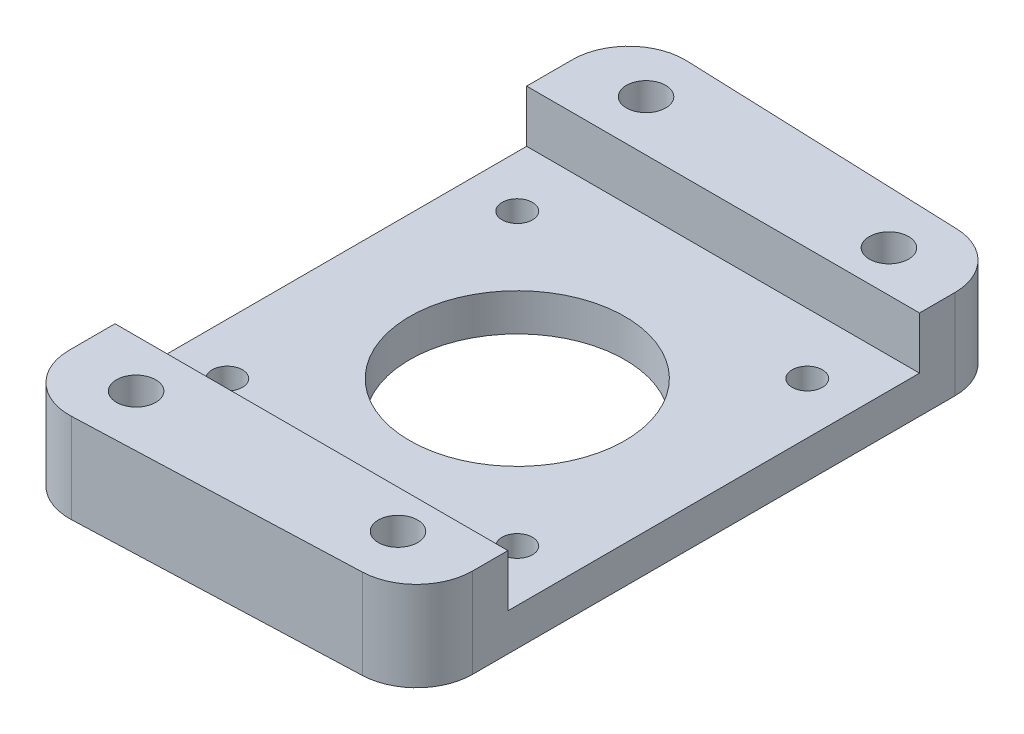
ISO-10303-21;
HEADER;
FILE_DESCRIPTION(('STEP AP214'),'2;1');
FILE_NAME('part.step','',(''),(''),'','','');
FILE_SCHEMA(('AUTOMOTIVE_DESIGN { 1 0 10303 214 1 1 1 1 }'));
ENDSEC;
DATA;
#1=APPLICATION_CONTEXT('core data for automotive mechanical design processes');
#2=APPLICATION_PROTOCOL_DEFINITION('international standard','automotive_design',2000,#1);
#3=PRODUCT_CONTEXT('',#1,'mechanical');
#4=PRODUCT('Part','Part','',(#3));
#5=PRODUCT_RELATED_PRODUCT_CATEGORY('part','',(#4));
#6=PRODUCT_DEFINITION_FORMATION('','',#4);
#7=PRODUCT_DEFINITION_CONTEXT('part definition',#1,'design');
#8=PRODUCT_DEFINITION('design','',#6,#7);
#9=PRODUCT_DEFINITION_SHAPE('','',#8);
#10=(LENGTH_UNIT() NAMED_UNIT(*) SI_UNIT(.MILLI.,.METRE.));
#11=(NAMED_UNIT(*) PLANE_ANGLE_UNIT() SI_UNIT($,.RADIAN.));
#12=(NAMED_UNIT(*) SI_UNIT($,.STERADIAN.) SOLID_ANGLE_UNIT());
#13=UNCERTAINTY_MEASURE_WITH_UNIT(LENGTH_MEASURE(1.E-05),#10,'distance_accuracy_value','');
#14=(GEOMETRIC_REPRESENTATION_CONTEXT(3) GLOBAL_UNCERTAINTY_ASSIGNED_CONTEXT((#13)) GLOBAL_UNIT_ASSIGNED_CONTEXT((#10,
#11,#12)) REPRESENTATION_CONTEXT('',''));
#15=CARTESIAN_POINT('',(0.,0.,0.));
#16=DIRECTION('',(0.,0.,1.));
#17=DIRECTION('',(1.,0.,0.));
#18=AXIS2_PLACEMENT_3D('',#15,#16,#17);
#19=CARTESIAN_POINT('',(0.,4.,0.));
#20=DIRECTION('',(0.,-1.,0.));
#21=DIRECTION('',(0.,0.,-1.));
#22=AXIS2_PLACEMENT_3D('',#19,#20,#21);
#23=PLANE('',#22);
#24=CARTESIAN_POINT('',(0.,4.,0.));
#25=DIRECTION('',(0.,1.,0.));
#26=DIRECTION('',(0.,0.,1.));
#27=AXIS2_PLACEMENT_3D('',#24,#25,#26);
#28=CIRCLE('',#27,11.5);
#29=CARTESIAN_POINT('',(0.,4.,11.5));
#30=VERTEX_POINT('',#29);
#31=EDGE_CURVE('E225',#30,#30,#28,.T.);
#32=ORIENTED_EDGE('',*,*,#31,.F.);
#33=EDGE_LOOP('',(#32));
#34=FACE_BOUND('',#33,.T.);
#35=CARTESIAN_POINT('',(-15.5,4.,-15.5));
#36=DIRECTION('',(0.,1.,0.));
#37=DIRECTION('',(0.,0.,1.));
#38=AXIS2_PLACEMENT_3D('',#35,#36,#37);
#39=CIRCLE('',#38,1.625);
#40=CARTESIAN_POINT('',(-15.5,4.,-13.875));
#41=VERTEX_POINT('',#40);
#42=EDGE_CURVE('E201',#41,#41,#39,.T.);
#43=ORIENTED_EDGE('',*,*,#42,.F.);
#44=EDGE_LOOP('',(#43));
#45=FACE_BOUND('',#44,.T.);
#46=CARTESIAN_POINT('',(15.5,4.,-15.5));
#47=DIRECTION('',(0.,1.,0.));
#48=DIRECTION('',(0.,0.,1.));
#49=AXIS2_PLACEMENT_3D('',#46,#47,#48);
#50=CIRCLE('',#49,1.625);
#51=CARTESIAN_POINT('',(15.5,4.,-13.875));
#52=VERTEX_POINT('',#51);
#53=EDGE_CURVE('E202',#52,#52,#50,.T.);
#54=ORIENTED_EDGE('',*,*,#53,.F.);
#55=EDGE_LOOP('',(#54));
#56=FACE_BOUND('',#55,.T.);
#57=CARTESIAN_POINT('',(15.5,4.,15.5));
#58=DIRECTION('',(0.,1.,0.));
#59=DIRECTION('',(0.,0.,1.));
#60=AXIS2_PLACEMENT_3D('',#57,#58,#59);
#61=CIRCLE('',#60,1.625);
#62=CARTESIAN_POINT('',(15.5,4.,17.125));
#63=VERTEX_POINT('',#62);
#64=EDGE_CURVE('E210',#63,#63,#61,.T.);
#65=ORIENTED_EDGE('',*,*,#64,.F.);
#66=EDGE_LOOP('',(#65));
#67=FACE_BOUND('',#66,.T.);
#68=CARTESIAN_POINT('',(-15.5,4.,15.5));
#69=DIRECTION('',(0.,1.,0.));
#70=DIRECTION('',(0.,0.,1.));
#71=AXIS2_PLACEMENT_3D('',#68,#69,#70);
#72=CIRCLE('',#71,1.625);
#73=CARTESIAN_POINT('',(-15.5,4.,17.125));
#74=VERTEX_POINT('',#73);
#75=EDGE_CURVE('E193',#74,#74,#72,.T.);
#76=ORIENTED_EDGE('',*,*,#75,.F.);
#77=EDGE_LOOP('',(#76));
#78=FACE_BOUND('',#77,.T.);
#79=DIRECTION('',(1.,0.,0.));
#80=VECTOR('',#79,1.);
#81=CARTESIAN_POINT('',(21.,4.,-22.));
#82=LINE('',#81,#80);
#83=CARTESIAN_POINT('',(-21.,4.,-22.));
#84=VERTEX_POINT('',#83);
#85=CARTESIAN_POINT('',(21.,4.,-22.));
#86=VERTEX_POINT('',#85);
#87=EDGE_CURVE('E147',#84,#86,#82,.T.);
#88=ORIENTED_EDGE('',*,*,#87,.F.);
#89=DIRECTION('',(0.,0.,1.));
#90=VECTOR('',#89,1.);
#91=CARTESIAN_POINT('',(-21.,4.,33.1322853994245));
#92=LINE('',#91,#90);
#93=CARTESIAN_POINT('',(-21.,4.,22.));
#94=VERTEX_POINT('',#93);
#95=EDGE_CURVE('E237',#84,#94,#92,.T.);
#96=ORIENTED_EDGE('',*,*,#95,.T.);
#97=DIRECTION('',(1.,0.,0.));
#98=VECTOR('',#97,1.);
#99=CARTESIAN_POINT('',(21.,4.,22.));
#100=LINE('',#99,#98);
#101=CARTESIAN_POINT('',(21.,4.,22.));
#102=VERTEX_POINT('',#101);
#103=EDGE_CURVE('E170',#94,#102,#100,.T.);
#104=ORIENTED_EDGE('',*,*,#103,.T.);
#105=DIRECTION('',(0.,0.,-1.));
#106=VECTOR('',#105,1.);
#107=CARTESIAN_POINT('',(21.,4.,31.5520850869607));
#108=LINE('',#107,#106);
#109=EDGE_CURVE('E240',#102,#86,#108,.T.);
#110=ORIENTED_EDGE('',*,*,#109,.T.);
#111=EDGE_LOOP('',(#88,#96,#104,#110));
#112=FACE_BOUND('',#111,.T.);
#113=ADVANCED_FACE('F39',(#34,#45,#56,#67,#78,#112),#23,.F.);
#114=CARTESIAN_POINT('',(-21.,4.,33.1322853994245));
#115=DIRECTION('',(1.,0.,0.));
#116=DIRECTION('',(0.,0.,-1.));
#117=AXIS2_PLACEMENT_3D('',#114,#115,#116);
#118=PLANE('',#117);
#119=DIRECTION('',(0.,0.,1.));
#120=VECTOR('',#119,1.);
#121=CARTESIAN_POINT('',(-21.,9.575,-22.));
#122=LINE('',#121,#120);
#123=CARTESIAN_POINT('',(-21.,9.575,-26.9022973446123));
#124=VERTEX_POINT('',#123);
#125=CARTESIAN_POINT('',(-21.,9.575,-22.));
#126=VERTEX_POINT('',#125);
#127=EDGE_CURVE('E137',#124,#126,#122,.T.);
#128=ORIENTED_EDGE('',*,*,#127,.F.);
#129=DIRECTION('',(0.,-1.,0.));
#130=VECTOR('',#129,1.);
#131=CARTESIAN_POINT('',(-21.,4.,-26.9022973446123));
#132=LINE('',#131,#130);
#133=CARTESIAN_POINT('',(-21.,0.,-26.9022973446123));
#134=VERTEX_POINT('',#133);
#135=EDGE_CURVE('E259',#124,#134,#132,.T.);
#136=ORIENTED_EDGE('',*,*,#135,.T.);
#137=DIRECTION('',(0.,0.,1.));
#138=VECTOR('',#137,1.);
#139=CARTESIAN_POINT('',(-21.,0.,33.1322853994245));
#140=LINE('',#139,#138);
#141=CARTESIAN_POINT('',(-21.,0.,26.9022973446123));
#142=VERTEX_POINT('',#141);
#143=EDGE_CURVE('E233',#134,#142,#140,.T.);
#144=ORIENTED_EDGE('',*,*,#143,.T.);
#145=DIRECTION('',(0.,-1.,0.));
#146=VECTOR('',#145,1.);
#147=CARTESIAN_POINT('',(-21.,4.,26.9022973446123));
#148=LINE('',#147,#146);
#149=CARTESIAN_POINT('',(-21.,9.575,26.9022973446123));
#150=VERTEX_POINT('',#149);
#151=EDGE_CURVE('E244',#142,#150,#148,.F.);
#152=ORIENTED_EDGE('',*,*,#151,.T.);
#153=DIRECTION('',(0.,0.,-1.));
#154=VECTOR('',#153,1.);
#155=CARTESIAN_POINT('',(-21.,9.575,22.));
#156=LINE('',#155,#154);
#157=CARTESIAN_POINT('',(-21.,9.575,22.));
#158=VERTEX_POINT('',#157);
#159=EDGE_CURVE('E175',#150,#158,#156,.T.);
#160=ORIENTED_EDGE('',*,*,#159,.T.);
#161=DIRECTION('',(0.,-1.,0.));
#162=VECTOR('',#161,1.);
#163=CARTESIAN_POINT('',(-21.,9.575,22.));
#164=LINE('',#163,#162);
#165=EDGE_CURVE('E186',#158,#94,#164,.T.);
#166=ORIENTED_EDGE('',*,*,#165,.T.);
#167=ORIENTED_EDGE('',*,*,#95,.F.);
#168=DIRECTION('',(0.,-1.,0.));
#169=VECTOR('',#168,1.);
#170=CARTESIAN_POINT('',(-21.,9.575,-22.));
#171=LINE('',#170,#169);
#172=EDGE_CURVE('E151',#126,#84,#171,.T.);
#173=ORIENTED_EDGE('',*,*,#172,.F.);
#174=EDGE_LOOP('',(#128,#136,#144,#152,#160,#166,#167,#173));
#175=FACE_BOUND('',#174,.T.);
#176=ADVANCED_FACE('F321',(#175),#118,.F.);
#177=CARTESIAN_POINT('',(-21.,4.,33.1322853994245));
#178=DIRECTION('',(-0.0375972159741946,0.,-0.999292974733131));
#179=DIRECTION('',(-0.999292974733131,0.,0.0375972159741946));
#180=AXIS2_PLACEMENT_3D('',#177,#178,#179);
#181=PLANE('',#180);
#182=DIRECTION('',(0.999292974733131,0.,-0.0375972159741946));
#183=VECTOR('',#182,1.);
#184=CARTESIAN_POINT('',(-21.,0.,33.1322853994245));
#185=LINE('',#184,#183);
#186=CARTESIAN_POINT('',(-14.7744167041548,0.,32.8980551930111));
#187=VERTEX_POINT('',#186);
#188=CARTESIAN_POINT('',(15.2255832958452,0.,31.7693406841084));
#189=VERTEX_POINT('',#188);
#190=EDGE_CURVE('E248',#187,#189,#185,.T.);
#191=ORIENTED_EDGE('',*,*,#190,.T.);
#192=DIRECTION('',(0.,-1.,0.));
#193=VECTOR('',#192,1.);
#194=CARTESIAN_POINT('',(15.2255832958452,4.,31.7693406841084));
#195=LINE('',#194,#193);
#196=CARTESIAN_POINT('',(15.2255832958452,9.575,31.7693406841084));
#197=VERTEX_POINT('',#196);
#198=EDGE_CURVE('E61',#189,#197,#195,.F.);
#199=ORIENTED_EDGE('',*,*,#198,.T.);
#200=DIRECTION('',(-0.999292974733131,0.,0.0375972159741946));
#201=VECTOR('',#200,1.);
#202=CARTESIAN_POINT('',(-21.,9.575,33.1322853994245));
#203=LINE('',#202,#201);
#204=CARTESIAN_POINT('',(-14.7744167041548,9.575,32.8980551930111));
#205=VERTEX_POINT('',#204);
#206=EDGE_CURVE('E172',#197,#205,#203,.T.);
#207=ORIENTED_EDGE('',*,*,#206,.T.);
#208=DIRECTION('',(0.,-1.,0.));
#209=VECTOR('',#208,1.);
#210=CARTESIAN_POINT('',(-14.7744167041548,4.,32.8980551930111));
#211=LINE('',#210,#209);
#212=EDGE_CURVE('E294',#205,#187,#211,.T.);
#213=ORIENTED_EDGE('',*,*,#212,.T.);
#214=EDGE_LOOP('',(#191,#199,#207,#213));
#215=FACE_BOUND('',#214,.T.);
#216=ADVANCED_FACE('F302',(#215),#181,.F.);
#217=CARTESIAN_POINT('',(21.,4.,31.5520850869607));
#218=DIRECTION('',(-1.,0.,0.));
#219=DIRECTION('',(0.,0.,1.));
#220=AXIS2_PLACEMENT_3D('',#217,#218,#219);
#221=PLANE('',#220);
#222=DIRECTION('',(0.,0.,-1.));
#223=VECTOR('',#222,1.);
#224=CARTESIAN_POINT('',(21.,0.,31.5520850869607));
#225=LINE('',#224,#223);
#226=CARTESIAN_POINT('',(21.,0.,25.7735828357096));
#227=VERTEX_POINT('',#226);
#228=CARTESIAN_POINT('',(21.,0.,-25.7735828357096));
#229=VERTEX_POINT('',#228);
#230=EDGE_CURVE('E251',#227,#229,#225,.T.);
#231=ORIENTED_EDGE('',*,*,#230,.T.);
#232=DIRECTION('',(0.,-1.,0.));
#233=VECTOR('',#232,1.);
#234=CARTESIAN_POINT('',(21.,4.,-25.7735828357096));
#235=LINE('',#234,#233);
#236=CARTESIAN_POINT('',(21.,9.575,-25.7735828357096));
#237=VERTEX_POINT('',#236);
#238=EDGE_CURVE('E156',#229,#237,#235,.F.);
#239=ORIENTED_EDGE('',*,*,#238,.T.);
#240=DIRECTION('',(0.,0.,-1.));
#241=VECTOR('',#240,1.);
#242=CARTESIAN_POINT('',(21.,9.575,-31.5520850869607));
#243=LINE('',#242,#241);
#244=CARTESIAN_POINT('',(21.,9.575,-22.));
#245=VERTEX_POINT('',#244);
#246=EDGE_CURVE('E134',#245,#237,#243,.T.);
#247=ORIENTED_EDGE('',*,*,#246,.F.);
#248=DIRECTION('',(0.,-1.,0.));
#249=VECTOR('',#248,1.);
#250=CARTESIAN_POINT('',(21.,9.575,-22.));
#251=LINE('',#250,#249);
#252=EDGE_CURVE('E145',#245,#86,#251,.T.);
#253=ORIENTED_EDGE('',*,*,#252,.T.);
#254=ORIENTED_EDGE('',*,*,#109,.F.);
#255=DIRECTION('',(0.,-1.,0.));
#256=VECTOR('',#255,1.);
#257=CARTESIAN_POINT('',(21.,9.575,22.));
#258=LINE('',#257,#256);
#259=CARTESIAN_POINT('',(21.,9.575,22.));
#260=VERTEX_POINT('',#259);
#261=EDGE_CURVE('E190',#260,#102,#258,.T.);
#262=ORIENTED_EDGE('',*,*,#261,.F.);
#263=DIRECTION('',(0.,0.,1.));
#264=VECTOR('',#263,1.);
#265=CARTESIAN_POINT('',(21.,9.575,31.5520850869607));
#266=LINE('',#265,#264);
#267=CARTESIAN_POINT('',(21.,9.575,25.7735828357096));
#268=VERTEX_POINT('',#267);
#269=EDGE_CURVE('E182',#260,#268,#266,.T.);
#270=ORIENTED_EDGE('',*,*,#269,.T.);
#271=DIRECTION('',(0.,-1.,0.));
#272=VECTOR('',#271,1.);
#273=CARTESIAN_POINT('',(21.,4.,25.7735828357096));
#274=LINE('',#273,#272);
#275=EDGE_CURVE('E288',#268,#227,#274,.T.);
#276=ORIENTED_EDGE('',*,*,#275,.T.);
#277=EDGE_LOOP('',(#231,#239,#247,#253,#254,#262,#270,#276));
#278=FACE_BOUND('',#277,.T.);
#279=ADVANCED_FACE('F154',(#278),#221,.F.);
#280=CARTESIAN_POINT('',(-21.,4.,-33.1322853994245));
#281=DIRECTION('',(-0.0375972159741946,0.,0.999292974733131));
#282=DIRECTION('',(0.999292974733131,0.,0.0375972159741946));
#283=AXIS2_PLACEMENT_3D('',#280,#281,#282);
#284=PLANE('',#283);
#285=DIRECTION('',(-0.999292974733131,0.,-0.0375972159741946));
#286=VECTOR('',#285,1.);
#287=CARTESIAN_POINT('',(-21.,0.,-33.1322853994245));
#288=LINE('',#287,#286);
#289=CARTESIAN_POINT('',(15.2255832958452,0.,-31.7693406841084));
#290=VERTEX_POINT('',#289);
#291=CARTESIAN_POINT('',(-14.7744167041548,0.,-32.8980551930111));
#292=VERTEX_POINT('',#291);
#293=EDGE_CURVE('E241',#290,#292,#288,.T.);
#294=ORIENTED_EDGE('',*,*,#293,.T.);
#295=DIRECTION('',(0.,-1.,0.));
#296=VECTOR('',#295,1.);
#297=CARTESIAN_POINT('',(-14.7744167041548,4.,-32.8980551930111));
#298=LINE('',#297,#296);
#299=CARTESIAN_POINT('',(-14.7744167041548,9.575,-32.8980551930111));
#300=VERTEX_POINT('',#299);
#301=EDGE_CURVE('E279',#292,#300,#298,.F.);
#302=ORIENTED_EDGE('',*,*,#301,.T.);
#303=DIRECTION('',(-0.999292974733131,0.,-0.0375972159741946));
#304=VECTOR('',#303,1.);
#305=CARTESIAN_POINT('',(-21.,9.575,-33.1322853994245));
#306=LINE('',#305,#304);
#307=CARTESIAN_POINT('',(15.2255832958452,9.575,-31.7693406841084));
#308=VERTEX_POINT('',#307);
#309=EDGE_CURVE('E158',#308,#300,#306,.T.);
#310=ORIENTED_EDGE('',*,*,#309,.F.);
#311=DIRECTION('',(0.,-1.,0.));
#312=VECTOR('',#311,1.);
#313=CARTESIAN_POINT('',(15.2255832958452,4.,-31.7693406841084));
#314=LINE('',#313,#312);
#315=EDGE_CURVE('E275',#308,#290,#314,.T.);
#316=ORIENTED_EDGE('',*,*,#315,.T.);
#317=EDGE_LOOP('',(#294,#302,#310,#316));
#318=FACE_BOUND('',#317,.T.);
#319=ADVANCED_FACE('F343',(#318),#284,.F.);
#320=CARTESIAN_POINT('',(0.,0.,0.));
#321=DIRECTION('',(0.,-1.,0.));
#322=DIRECTION('',(0.,0.,-1.));
#323=AXIS2_PLACEMENT_3D('',#320,#321,#322);
#324=PLANE('',#323);
#325=CARTESIAN_POINT('',(-15.5,0.,15.5));
#326=DIRECTION('',(0.,1.,0.));
#327=DIRECTION('',(0.,0.,1.));
#328=AXIS2_PLACEMENT_3D('',#325,#326,#327);
#329=CIRCLE('',#328,1.625);
#330=CARTESIAN_POINT('',(-15.5,0.,17.125));
#331=VERTEX_POINT('',#330);
#332=EDGE_CURVE('E214',#331,#331,#329,.T.);
#333=ORIENTED_EDGE('',*,*,#332,.T.);
#334=EDGE_LOOP('',(#333));
#335=FACE_BOUND('',#334,.T.);
#336=CARTESIAN_POINT('',(15.5,0.,15.5));
#337=DIRECTION('',(0.,1.,0.));
#338=DIRECTION('',(0.,0.,1.));
#339=AXIS2_PLACEMENT_3D('',#336,#337,#338);
#340=CIRCLE('',#339,1.625);
#341=CARTESIAN_POINT('',(15.5,0.,17.125));
#342=VERTEX_POINT('',#341);
#343=EDGE_CURVE('E206',#342,#342,#340,.T.);
#344=ORIENTED_EDGE('',*,*,#343,.T.);
#345=EDGE_LOOP('',(#344));
#346=FACE_BOUND('',#345,.T.);
#347=CARTESIAN_POINT('',(15.5,0.,-15.5));
#348=DIRECTION('',(0.,1.,0.));
#349=DIRECTION('',(0.,0.,1.));
#350=AXIS2_PLACEMENT_3D('',#347,#348,#349);
#351=CIRCLE('',#350,1.625);
#352=CARTESIAN_POINT('',(15.5,0.,-13.875));
#353=VERTEX_POINT('',#352);
#354=EDGE_CURVE('E197',#353,#353,#351,.T.);
#355=ORIENTED_EDGE('',*,*,#354,.T.);
#356=EDGE_LOOP('',(#355));
#357=FACE_BOUND('',#356,.T.);
#358=CARTESIAN_POINT('',(-15.5,0.,-15.5));
#359=DIRECTION('',(0.,1.,0.));
#360=DIRECTION('',(0.,0.,1.));
#361=AXIS2_PLACEMENT_3D('',#358,#359,#360);
#362=CIRCLE('',#361,1.625);
#363=CARTESIAN_POINT('',(-15.5,0.,-13.875));
#364=VERTEX_POINT('',#363);
#365=EDGE_CURVE('E221',#364,#364,#362,.T.);
#366=ORIENTED_EDGE('',*,*,#365,.T.);
#367=EDGE_LOOP('',(#366));
#368=FACE_BOUND('',#367,.T.);
#369=CARTESIAN_POINT('',(0.,0.,0.));
#370=DIRECTION('',(0.,1.,0.));
#371=DIRECTION('',(0.,0.,1.));
#372=AXIS2_PLACEMENT_3D('',#369,#370,#371);
#373=CIRCLE('',#372,11.5);
#374=CARTESIAN_POINT('',(0.,0.,11.5));
#375=VERTEX_POINT('',#374);
#376=EDGE_CURVE('E229',#375,#375,#373,.T.);
#377=ORIENTED_EDGE('',*,*,#376,.T.);
#378=EDGE_LOOP('',(#377));
#379=FACE_BOUND('',#378,.T.);
#380=ORIENTED_EDGE('',*,*,#143,.F.);
#381=CARTESIAN_POINT('',(-15.,0.,-26.9022973446123));
#382=DIRECTION('',(0.,-1.,0.));
#383=DIRECTION('',(0.,0.,-1.));
#384=AXIS2_PLACEMENT_3D('',#381,#382,#383);
#385=CIRCLE('',#384,6.);
#386=EDGE_CURVE('E272',#134,#292,#385,.T.);
#387=ORIENTED_EDGE('',*,*,#386,.T.);
#388=ORIENTED_EDGE('',*,*,#293,.F.);
#389=CARTESIAN_POINT('',(15.,0.,-25.7735828357096));
#390=DIRECTION('',(0.,-1.,0.));
#391=DIRECTION('',(0.,0.,-1.));
#392=AXIS2_PLACEMENT_3D('',#389,#390,#391);
#393=CIRCLE('',#392,6.);
#394=EDGE_CURVE('E269',#290,#229,#393,.T.);
#395=ORIENTED_EDGE('',*,*,#394,.T.);
#396=ORIENTED_EDGE('',*,*,#230,.F.);
#397=CARTESIAN_POINT('',(15.,0.,25.7735828357096));
#398=DIRECTION('',(0.,-1.,0.));
#399=DIRECTION('',(0.,0.,-1.));
#400=AXIS2_PLACEMENT_3D('',#397,#398,#399);
#401=CIRCLE('',#400,6.);
#402=EDGE_CURVE('E266',#227,#189,#401,.T.);
#403=ORIENTED_EDGE('',*,*,#402,.T.);
#404=ORIENTED_EDGE('',*,*,#190,.F.);
#405=CARTESIAN_POINT('',(-15.,0.,26.9022973446123));
#406=DIRECTION('',(0.,-1.,0.));
#407=DIRECTION('',(0.,0.,-1.));
#408=AXIS2_PLACEMENT_3D('',#405,#406,#407);
#409=CIRCLE('',#408,6.);
#410=EDGE_CURVE('E263',#187,#142,#409,.T.);
#411=ORIENTED_EDGE('',*,*,#410,.T.);
#412=EDGE_LOOP('',(#380,#387,#388,#395,#396,#403,#404,#411));
#413=FACE_BOUND('',#412,.T.);
#414=ADVANCED_FACE('F306',(#335,#346,#357,#368,#379,#413),#324,.T.);
#415=CARTESIAN_POINT('',(0.,0.,0.));
#416=DIRECTION('',(0.,1.,0.));
#417=DIRECTION('',(0.,0.,1.));
#418=AXIS2_PLACEMENT_3D('',#415,#416,#417);
#419=CYLINDRICAL_SURFACE('',#418,11.5);
#420=ORIENTED_EDGE('',*,*,#376,.F.);
#421=EDGE_LOOP('',(#420));
#422=FACE_BOUND('',#421,.T.);
#423=ORIENTED_EDGE('',*,*,#31,.T.);
#424=EDGE_LOOP('',(#423));
#425=FACE_BOUND('',#424,.T.);
#426=ADVANCED_FACE('F339',(#422,#425),#419,.F.);
#427=CARTESIAN_POINT('',(-15.5,0.,-15.5));
#428=DIRECTION('',(0.,1.,0.));
#429=DIRECTION('',(0.,0.,1.));
#430=AXIS2_PLACEMENT_3D('',#427,#428,#429);
#431=CYLINDRICAL_SURFACE('',#430,1.625);
#432=ORIENTED_EDGE('',*,*,#365,.F.);
#433=EDGE_LOOP('',(#432));
#434=FACE_BOUND('',#433,.T.);
#435=ORIENTED_EDGE('',*,*,#42,.T.);
#436=EDGE_LOOP('',(#435));
#437=FACE_BOUND('',#436,.T.);
#438=ADVANCED_FACE('F549',(#434,#437),#431,.F.);
#439=CARTESIAN_POINT('',(15.5,0.,-15.5));
#440=DIRECTION('',(0.,1.,0.));
#441=DIRECTION('',(0.,0.,1.));
#442=AXIS2_PLACEMENT_3D('',#439,#440,#441);
#443=CYLINDRICAL_SURFACE('',#442,1.625);
#444=ORIENTED_EDGE('',*,*,#354,.F.);
#445=EDGE_LOOP('',(#444));
#446=FACE_BOUND('',#445,.T.);
#447=ORIENTED_EDGE('',*,*,#53,.T.);
#448=EDGE_LOOP('',(#447));
#449=FACE_BOUND('',#448,.T.);
#450=ADVANCED_FACE('F539',(#446,#449),#443,.F.);
#451=CARTESIAN_POINT('',(15.5,0.,15.5));
#452=DIRECTION('',(0.,1.,0.));
#453=DIRECTION('',(0.,0.,1.));
#454=AXIS2_PLACEMENT_3D('',#451,#452,#453);
#455=CYLINDRICAL_SURFACE('',#454,1.625);
#456=ORIENTED_EDGE('',*,*,#343,.F.);
#457=EDGE_LOOP('',(#456));
#458=FACE_BOUND('',#457,.T.);
#459=ORIENTED_EDGE('',*,*,#64,.T.);
#460=EDGE_LOOP('',(#459));
#461=FACE_BOUND('',#460,.T.);
#462=ADVANCED_FACE('F529',(#458,#461),#455,.F.);
#463=CARTESIAN_POINT('',(-15.5,0.,15.5));
#464=DIRECTION('',(0.,1.,0.));
#465=DIRECTION('',(0.,0.,1.));
#466=AXIS2_PLACEMENT_3D('',#463,#464,#465);
#467=CYLINDRICAL_SURFACE('',#466,1.625);
#468=ORIENTED_EDGE('',*,*,#332,.F.);
#469=EDGE_LOOP('',(#468));
#470=FACE_BOUND('',#469,.T.);
#471=ORIENTED_EDGE('',*,*,#75,.T.);
#472=EDGE_LOOP('',(#471));
#473=FACE_BOUND('',#472,.T.);
#474=ADVANCED_FACE('F521',(#470,#473),#467,.F.);
#475=CARTESIAN_POINT('',(21.,9.575,22.));
#476=DIRECTION('',(0.,0.,-1.));
#477=DIRECTION('',(-1.,0.,0.));
#478=AXIS2_PLACEMENT_3D('',#475,#476,#477);
#479=PLANE('',#478);
#480=ORIENTED_EDGE('',*,*,#103,.F.);
#481=ORIENTED_EDGE('',*,*,#165,.F.);
#482=DIRECTION('',(1.,0.,0.));
#483=VECTOR('',#482,1.);
#484=CARTESIAN_POINT('',(21.,9.575,22.));
#485=LINE('',#484,#483);
#486=EDGE_CURVE('E178',#158,#260,#485,.T.);
#487=ORIENTED_EDGE('',*,*,#486,.T.);
#488=ORIENTED_EDGE('',*,*,#261,.T.);
#489=EDGE_LOOP('',(#480,#481,#487,#488));
#490=FACE_BOUND('',#489,.T.);
#491=ADVANCED_FACE('F318',(#490),#479,.T.);
#492=CARTESIAN_POINT('',(0.,9.575,0.));
#493=DIRECTION('',(0.,1.,0.));
#494=DIRECTION('',(0.,0.,1.));
#495=AXIS2_PLACEMENT_3D('',#492,#493,#494);
#496=PLANE('',#495);
#497=CARTESIAN_POINT('',(13.3404551588972,9.575,26.091351992217));
#498=DIRECTION('',(0.,1.,0.));
#499=DIRECTION('',(0.,0.,1.));
#500=AXIS2_PLACEMENT_3D('',#497,#498,#499);
#501=CIRCLE('',#500,2.09999999999999);
#502=CARTESIAN_POINT('',(13.3404551588972,9.575,28.191351992217));
#503=VERTEX_POINT('',#502);
#504=EDGE_CURVE('E624',#503,#503,#501,.T.);
#505=ORIENTED_EDGE('',*,*,#504,.F.);
#506=EDGE_LOOP('',(#505));
#507=FACE_BOUND('',#506,.T.);
#508=CARTESIAN_POINT('',(-13.6404551588973,9.575,27.1064768235202));
#509=DIRECTION('',(0.,1.,0.));
#510=DIRECTION('',(0.,0.,1.));
#511=AXIS2_PLACEMENT_3D('',#508,#509,#510);
#512=CIRCLE('',#511,2.1);
#513=CARTESIAN_POINT('',(-13.6404551588973,9.575,29.2064768235202));
#514=VERTEX_POINT('',#513);
#515=EDGE_CURVE('E627',#514,#514,#512,.T.);
#516=ORIENTED_EDGE('',*,*,#515,.F.);
#517=EDGE_LOOP('',(#516));
#518=FACE_BOUND('',#517,.T.);
#519=ORIENTED_EDGE('',*,*,#206,.F.);
#520=CARTESIAN_POINT('',(15.,9.575,25.7735828357096));
#521=DIRECTION('',(0.,1.,0.));
#522=DIRECTION('',(0.,0.,1.));
#523=AXIS2_PLACEMENT_3D('',#520,#521,#522);
#524=CIRCLE('',#523,6.);
#525=EDGE_CURVE('E11',#197,#268,#524,.T.);
#526=ORIENTED_EDGE('',*,*,#525,.T.);
#527=ORIENTED_EDGE('',*,*,#269,.F.);
#528=ORIENTED_EDGE('',*,*,#486,.F.);
#529=ORIENTED_EDGE('',*,*,#159,.F.);
#530=CARTESIAN_POINT('',(-15.,9.575,26.9022973446123));
#531=DIRECTION('',(0.,1.,0.));
#532=DIRECTION('',(0.,0.,1.));
#533=AXIS2_PLACEMENT_3D('',#530,#531,#532);
#534=CIRCLE('',#533,6.);
#535=EDGE_CURVE('E48',#150,#205,#534,.T.);
#536=ORIENTED_EDGE('',*,*,#535,.T.);
#537=EDGE_LOOP('',(#519,#526,#527,#528,#529,#536));
#538=FACE_BOUND('',#537,.T.);
#539=ADVANCED_FACE('F314',(#507,#518,#538),#496,.T.);
#540=CARTESIAN_POINT('',(21.,9.575,-22.));
#541=DIRECTION('',(0.,0.,-1.));
#542=DIRECTION('',(-1.,0.,0.));
#543=AXIS2_PLACEMENT_3D('',#540,#541,#542);
#544=PLANE('',#543);
#545=ORIENTED_EDGE('',*,*,#87,.T.);
#546=ORIENTED_EDGE('',*,*,#252,.F.);
#547=DIRECTION('',(1.,0.,0.));
#548=VECTOR('',#547,1.);
#549=CARTESIAN_POINT('',(21.,9.575,-22.));
#550=LINE('',#549,#548);
#551=EDGE_CURVE('E129',#126,#245,#550,.T.);
#552=ORIENTED_EDGE('',*,*,#551,.F.);
#553=ORIENTED_EDGE('',*,*,#172,.T.);
#554=EDGE_LOOP('',(#545,#546,#552,#553));
#555=FACE_BOUND('',#554,.T.);
#556=ADVANCED_FACE('F146',(#555),#544,.F.);
#557=CARTESIAN_POINT('',(0.,9.575,0.));
#558=DIRECTION('',(0.,1.,0.));
#559=DIRECTION('',(0.,0.,-1.));
#560=AXIS2_PLACEMENT_3D('',#557,#558,#559);
#561=PLANE('',#560);
#562=CARTESIAN_POINT('',(-13.6404551588973,9.575,-27.4064768235201));
#563=DIRECTION('',(0.,1.,0.));
#564=DIRECTION('',(0.,0.,1.));
#565=AXIS2_PLACEMENT_3D('',#562,#563,#564);
#566=CIRCLE('',#565,2.1);
#567=CARTESIAN_POINT('',(-13.6404551588973,9.575,-25.3064768235201));
#568=VERTEX_POINT('',#567);
#569=EDGE_CURVE('E638',#568,#568,#566,.T.);
#570=ORIENTED_EDGE('',*,*,#569,.F.);
#571=EDGE_LOOP('',(#570));
#572=FACE_BOUND('',#571,.T.);
#573=CARTESIAN_POINT('',(13.3404551588972,9.575,-26.3913519922169));
#574=DIRECTION('',(0.,1.,0.));
#575=DIRECTION('',(0.,0.,1.));
#576=AXIS2_PLACEMENT_3D('',#573,#574,#575);
#577=CIRCLE('',#576,2.1);
#578=CARTESIAN_POINT('',(13.3404551588972,9.575,-24.2913519922169));
#579=VERTEX_POINT('',#578);
#580=EDGE_CURVE('E646',#579,#579,#577,.T.);
#581=ORIENTED_EDGE('',*,*,#580,.F.);
#582=EDGE_LOOP('',(#581));
#583=FACE_BOUND('',#582,.T.);
#584=ORIENTED_EDGE('',*,*,#309,.T.);
#585=CARTESIAN_POINT('',(-15.,9.575,-26.9022973446123));
#586=DIRECTION('',(0.,1.,0.));
#587=DIRECTION('',(0.,0.,1.));
#588=AXIS2_PLACEMENT_3D('',#585,#586,#587);
#589=CIRCLE('',#588,6.);
#590=EDGE_CURVE('E285',#300,#124,#589,.T.);
#591=ORIENTED_EDGE('',*,*,#590,.T.);
#592=ORIENTED_EDGE('',*,*,#127,.T.);
#593=ORIENTED_EDGE('',*,*,#551,.T.);
#594=ORIENTED_EDGE('',*,*,#246,.T.);
#595=CARTESIAN_POINT('',(15.,9.575,-25.7735828357096));
#596=DIRECTION('',(0.,1.,0.));
#597=DIRECTION('',(0.,0.,1.));
#598=AXIS2_PLACEMENT_3D('',#595,#596,#597);
#599=CIRCLE('',#598,6.);
#600=EDGE_CURVE('E282',#237,#308,#599,.T.);
#601=ORIENTED_EDGE('',*,*,#600,.T.);
#602=EDGE_LOOP('',(#584,#591,#592,#593,#594,#601));
#603=FACE_BOUND('',#602,.T.);
#604=ADVANCED_FACE('F132',(#572,#583,#603),#561,.T.);
#605=CARTESIAN_POINT('',(13.3404551588972,3.575,-26.3913519922169));
#606=DIRECTION('',(0.,1.,0.));
#607=DIRECTION('',(0.,0.,1.));
#608=AXIS2_PLACEMENT_3D('',#605,#606,#607);
#609=CYLINDRICAL_SURFACE('',#608,2.1);
#610=CARTESIAN_POINT('',(13.3404551588972,3.575,-26.3913519922169));
#611=DIRECTION('',(0.,1.,0.));
#612=DIRECTION('',(0.,0.,1.));
#613=AXIS2_PLACEMENT_3D('',#610,#611,#612);
#614=CIRCLE('',#613,2.1);
#615=CARTESIAN_POINT('',(13.3404551588972,3.575,-24.2913519922169));
#616=VERTEX_POINT('',#615);
#617=EDGE_CURVE('E650',#616,#616,#614,.T.);
#618=ORIENTED_EDGE('',*,*,#617,.F.);
#619=EDGE_LOOP('',(#618));
#620=FACE_BOUND('',#619,.T.);
#621=ORIENTED_EDGE('',*,*,#580,.T.);
#622=EDGE_LOOP('',(#621));
#623=FACE_BOUND('',#622,.T.);
#624=ADVANCED_FACE('F449',(#620,#623),#609,.F.);
#625=CARTESIAN_POINT('',(13.3404551588972,3.575,-26.3913519922169));
#626=DIRECTION('',(0.,1.,0.));
#627=DIRECTION('',(0.,0.,1.));
#628=AXIS2_PLACEMENT_3D('',#625,#626,#627);
#629=PLANE('',#628);
#630=ORIENTED_EDGE('',*,*,#617,.T.);
#631=EDGE_LOOP('',(#630));
#632=FACE_BOUND('',#631,.T.);
#633=ADVANCED_FACE('F440',(#632),#629,.T.);
#634=CARTESIAN_POINT('',(-13.6404551588973,3.575,-27.4064768235201));
#635=DIRECTION('',(0.,1.,0.));
#636=DIRECTION('',(0.,0.,1.));
#637=AXIS2_PLACEMENT_3D('',#634,#635,#636);
#638=CYLINDRICAL_SURFACE('',#637,2.1);
#639=CARTESIAN_POINT('',(-13.6404551588973,3.575,-27.4064768235201));
#640=DIRECTION('',(0.,1.,0.));
#641=DIRECTION('',(0.,0.,1.));
#642=AXIS2_PLACEMENT_3D('',#639,#640,#641);
#643=CIRCLE('',#642,2.1);
#644=CARTESIAN_POINT('',(-13.6404551588973,3.575,-25.3064768235201));
#645=VERTEX_POINT('',#644);
#646=EDGE_CURVE('E642',#645,#645,#643,.T.);
#647=ORIENTED_EDGE('',*,*,#646,.F.);
#648=EDGE_LOOP('',(#647));
#649=FACE_BOUND('',#648,.T.);
#650=ORIENTED_EDGE('',*,*,#569,.T.);
#651=EDGE_LOOP('',(#650));
#652=FACE_BOUND('',#651,.T.);
#653=ADVANCED_FACE('F431',(#649,#652),#638,.F.);
#654=CARTESIAN_POINT('',(-13.6404551588973,3.575,-27.4064768235201));
#655=DIRECTION('',(0.,1.,0.));
#656=DIRECTION('',(0.,0.,1.));
#657=AXIS2_PLACEMENT_3D('',#654,#655,#656);
#658=PLANE('',#657);
#659=ORIENTED_EDGE('',*,*,#646,.T.);
#660=EDGE_LOOP('',(#659));
#661=FACE_BOUND('',#660,.T.);
#662=ADVANCED_FACE('F422',(#661),#658,.T.);
#663=CARTESIAN_POINT('',(-13.6404551588973,3.575,27.1064768235202));
#664=DIRECTION('',(0.,1.,0.));
#665=DIRECTION('',(0.,0.,1.));
#666=AXIS2_PLACEMENT_3D('',#663,#664,#665);
#667=CYLINDRICAL_SURFACE('',#666,2.1);
#668=CARTESIAN_POINT('',(-13.6404551588973,3.575,27.1064768235202));
#669=DIRECTION('',(0.,1.,0.));
#670=DIRECTION('',(0.,0.,1.));
#671=AXIS2_PLACEMENT_3D('',#668,#669,#670);
#672=CIRCLE('',#671,2.1);
#673=CARTESIAN_POINT('',(-13.6404551588973,3.575,29.2064768235202));
#674=VERTEX_POINT('',#673);
#675=EDGE_CURVE('E168',#674,#674,#672,.T.);
#676=ORIENTED_EDGE('',*,*,#675,.F.);
#677=EDGE_LOOP('',(#676));
#678=FACE_BOUND('',#677,.T.);
#679=ORIENTED_EDGE('',*,*,#515,.T.);
#680=EDGE_LOOP('',(#679));
#681=FACE_BOUND('',#680,.T.);
#682=ADVANCED_FACE('F413',(#678,#681),#667,.F.);
#683=CARTESIAN_POINT('',(-13.6404551588973,3.575,27.1064768235202));
#684=DIRECTION('',(0.,1.,0.));
#685=DIRECTION('',(0.,0.,1.));
#686=AXIS2_PLACEMENT_3D('',#683,#684,#685);
#687=PLANE('',#686);
#688=ORIENTED_EDGE('',*,*,#675,.T.);
#689=EDGE_LOOP('',(#688));
#690=FACE_BOUND('',#689,.T.);
#691=ADVANCED_FACE('F404',(#690),#687,.T.);
#692=CARTESIAN_POINT('',(13.3404551588972,3.575,26.091351992217));
#693=DIRECTION('',(0.,1.,0.));
#694=DIRECTION('',(0.,0.,1.));
#695=AXIS2_PLACEMENT_3D('',#692,#693,#694);
#696=CYLINDRICAL_SURFACE('',#695,2.09999999999999);
#697=CARTESIAN_POINT('',(13.3404551588972,3.575,26.091351992217));
#698=DIRECTION('',(0.,1.,0.));
#699=DIRECTION('',(0.,0.,1.));
#700=AXIS2_PLACEMENT_3D('',#697,#698,#699);
#701=CIRCLE('',#700,2.09999999999999);
#702=CARTESIAN_POINT('',(13.3404551588972,3.575,28.191351992217));
#703=VERTEX_POINT('',#702);
#704=EDGE_CURVE('E630',#703,#703,#701,.T.);
#705=ORIENTED_EDGE('',*,*,#704,.F.);
#706=EDGE_LOOP('',(#705));
#707=FACE_BOUND('',#706,.T.);
#708=ORIENTED_EDGE('',*,*,#504,.T.);
#709=EDGE_LOOP('',(#708));
#710=FACE_BOUND('',#709,.T.);
#711=ADVANCED_FACE('F394',(#707,#710),#696,.F.);
#712=CARTESIAN_POINT('',(13.3404551588972,3.575,26.091351992217));
#713=DIRECTION('',(0.,1.,0.));
#714=DIRECTION('',(0.,0.,1.));
#715=AXIS2_PLACEMENT_3D('',#712,#713,#714);
#716=PLANE('',#715);
#717=ORIENTED_EDGE('',*,*,#704,.T.);
#718=EDGE_LOOP('',(#717));
#719=FACE_BOUND('',#718,.T.);
#720=ADVANCED_FACE('F355',(#719),#716,.T.);
#721=CARTESIAN_POINT('',(-15.,4.,-26.9022973446123));
#722=DIRECTION('',(0.,-1.,0.));
#723=DIRECTION('',(0.,0.,-1.));
#724=AXIS2_PLACEMENT_3D('',#721,#722,#723);
#725=CYLINDRICAL_SURFACE('',#724,6.);
#726=ORIENTED_EDGE('',*,*,#590,.F.);
#727=ORIENTED_EDGE('',*,*,#301,.F.);
#728=ORIENTED_EDGE('',*,*,#386,.F.);
#729=ORIENTED_EDGE('',*,*,#135,.F.);
#730=EDGE_LOOP('',(#726,#727,#728,#729));
#731=FACE_BOUND('',#730,.T.);
#732=ADVANCED_FACE('F352',(#731),#725,.T.);
#733=CARTESIAN_POINT('',(15.,4.,-25.7735828357096));
#734=DIRECTION('',(0.,-1.,0.));
#735=DIRECTION('',(0.,0.,-1.));
#736=AXIS2_PLACEMENT_3D('',#733,#734,#735);
#737=CYLINDRICAL_SURFACE('',#736,6.);
#738=ORIENTED_EDGE('',*,*,#600,.F.);
#739=ORIENTED_EDGE('',*,*,#238,.F.);
#740=ORIENTED_EDGE('',*,*,#394,.F.);
#741=ORIENTED_EDGE('',*,*,#315,.F.);
#742=EDGE_LOOP('',(#738,#739,#740,#741));
#743=FACE_BOUND('',#742,.T.);
#744=ADVANCED_FACE('F327',(#743),#737,.T.);
#745=CARTESIAN_POINT('',(15.,4.,25.7735828357096));
#746=DIRECTION('',(0.,-1.,0.));
#747=DIRECTION('',(0.,0.,-1.));
#748=AXIS2_PLACEMENT_3D('',#745,#746,#747);
#749=CYLINDRICAL_SURFACE('',#748,6.);
#750=ORIENTED_EDGE('',*,*,#525,.F.);
#751=ORIENTED_EDGE('',*,*,#198,.F.);
#752=ORIENTED_EDGE('',*,*,#402,.F.);
#753=ORIENTED_EDGE('',*,*,#275,.F.);
#754=EDGE_LOOP('',(#750,#751,#752,#753));
#755=FACE_BOUND('',#754,.T.);
#756=ADVANCED_FACE('F311',(#755),#749,.T.);
#757=CARTESIAN_POINT('',(-15.,4.,26.9022973446123));
#758=DIRECTION('',(0.,-1.,0.));
#759=DIRECTION('',(0.,0.,-1.));
#760=AXIS2_PLACEMENT_3D('',#757,#758,#759);
#761=CYLINDRICAL_SURFACE('',#760,6.);
#762=ORIENTED_EDGE('',*,*,#535,.F.);
#763=ORIENTED_EDGE('',*,*,#151,.F.);
#764=ORIENTED_EDGE('',*,*,#410,.F.);
#765=ORIENTED_EDGE('',*,*,#212,.F.);
#766=EDGE_LOOP('',(#762,#763,#764,#765));
#767=FACE_BOUND('',#766,.T.);
#768=ADVANCED_FACE('F41',(#767),#761,.T.);
#769=CLOSED_SHELL('',(#113,#176,#216,#279,#319,#414,#426,#438,#450,#462,#474,#491,#539,#556,
#604,#624,#633,#653,#662,#682,#691,#711,#720,#732,#744,#756,#768));
#770=MANIFOLD_SOLID_BREP('B2',#769);
#771=ADVANCED_BREP_SHAPE_REPRESENTATION('',(#18,#770),#14);
#772=SHAPE_DEFINITION_REPRESENTATION(#9,#771);
ENDSEC;
END-ISO-10303-21;
